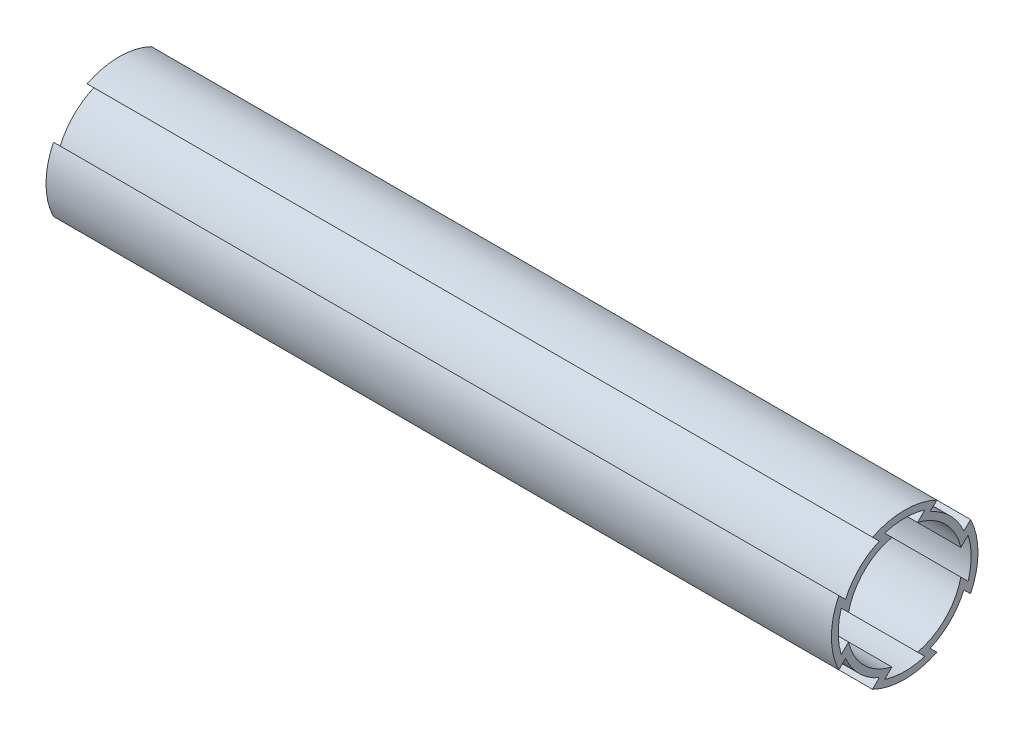
ISO-10303-21;
HEADER;
FILE_DESCRIPTION(('STEP AP214'),'2;1');
FILE_NAME('part.step','',(''),(''),'','','');
FILE_SCHEMA(('AUTOMOTIVE_DESIGN { 1 0 10303 214 1 1 1 1 }'));
ENDSEC;
DATA;
#1=APPLICATION_CONTEXT('core data for automotive mechanical design processes');
#2=APPLICATION_PROTOCOL_DEFINITION('international standard','automotive_design',2000,#1);
#3=PRODUCT_CONTEXT('',#1,'mechanical');
#4=PRODUCT('Part','Part','',(#3));
#5=PRODUCT_RELATED_PRODUCT_CATEGORY('part','',(#4));
#6=PRODUCT_DEFINITION_FORMATION('','',#4);
#7=PRODUCT_DEFINITION_CONTEXT('part definition',#1,'design');
#8=PRODUCT_DEFINITION('design','',#6,#7);
#9=PRODUCT_DEFINITION_SHAPE('','',#8);
#10=(LENGTH_UNIT() NAMED_UNIT(*) SI_UNIT(.MILLI.,.METRE.));
#11=(NAMED_UNIT(*) PLANE_ANGLE_UNIT() SI_UNIT($,.RADIAN.));
#12=(NAMED_UNIT(*) SI_UNIT($,.STERADIAN.) SOLID_ANGLE_UNIT());
#13=UNCERTAINTY_MEASURE_WITH_UNIT(LENGTH_MEASURE(1.E-05),#10,'distance_accuracy_value','');
#14=(GEOMETRIC_REPRESENTATION_CONTEXT(3) GLOBAL_UNCERTAINTY_ASSIGNED_CONTEXT((#13)) GLOBAL_UNIT_ASSIGNED_CONTEXT((#10,
#11,#12)) REPRESENTATION_CONTEXT('',''));
#15=CARTESIAN_POINT('',(0.,0.,0.));
#16=DIRECTION('',(0.,0.,1.));
#17=DIRECTION('',(1.,0.,0.));
#18=AXIS2_PLACEMENT_3D('',#15,#16,#17);
#19=CARTESIAN_POINT('',(150.,0.,0.));
#20=DIRECTION('',(1.,0.,0.));
#21=DIRECTION('',(0.,0.,-1.));
#22=AXIS2_PLACEMENT_3D('',#19,#20,#21);
#23=PLANE('',#22);
#24=CARTESIAN_POINT('',(150.,0.,0.));
#25=DIRECTION('',(1.,0.,0.));
#26=DIRECTION('',(0.,0.,-1.));
#27=AXIS2_PLACEMENT_3D('',#24,#25,#26);
#28=CIRCLE('',#27,12.3);
#29=CARTESIAN_POINT('',(150.,11.297790668331,4.86311895953339));
#30=VERTEX_POINT('',#29);
#31=CARTESIAN_POINT('',(150.,4.86311895953343,11.297790668331));
#32=VERTEX_POINT('',#31);
#33=EDGE_CURVE('E425',#30,#32,#28,.T.);
#34=ORIENTED_EDGE('',*,*,#33,.T.);
#35=DIRECTION('',(0.,0.707106781186547,0.707106781186547));
#36=VECTOR('',#35,1.);
#37=CARTESIAN_POINT('',(150.,4.86311895953343,11.297790668331));
#38=LINE('',#37,#36);
#39=CARTESIAN_POINT('',(150.,6.14475525816791,12.5794269669654));
#40=VERTEX_POINT('',#39);
#41=EDGE_CURVE('E429',#32,#40,#38,.T.);
#42=ORIENTED_EDGE('',*,*,#41,.T.);
#43=CARTESIAN_POINT('',(150.,0.,0.));
#44=DIRECTION('',(1.,0.,0.));
#45=DIRECTION('',(0.,0.,-1.));
#46=AXIS2_PLACEMENT_3D('',#43,#44,#45);
#47=CIRCLE('',#46,14.);
#48=CARTESIAN_POINT('',(150.,-6.14475525816791,12.5794269669654));
#49=VERTEX_POINT('',#48);
#50=EDGE_CURVE('E433',#40,#49,#47,.T.);
#51=ORIENTED_EDGE('',*,*,#50,.T.);
#52=DIRECTION('',(0.,0.707106781186548,-0.707106781186548));
#53=VECTOR('',#52,1.);
#54=CARTESIAN_POINT('',(150.,-6.14475525816792,12.5794269669654));
#55=LINE('',#54,#53);
#56=CARTESIAN_POINT('',(150.,-4.86311895953345,11.297790668331));
#57=VERTEX_POINT('',#56);
#58=EDGE_CURVE('E436',#49,#57,#55,.T.);
#59=ORIENTED_EDGE('',*,*,#58,.T.);
#60=CARTESIAN_POINT('',(150.,0.,0.));
#61=DIRECTION('',(1.,0.,0.));
#62=DIRECTION('',(0.,0.,-1.));
#63=AXIS2_PLACEMENT_3D('',#60,#61,#62);
#64=CIRCLE('',#63,12.3);
#65=CARTESIAN_POINT('',(150.,-11.297790668331,4.8631189595334));
#66=VERTEX_POINT('',#65);
#67=EDGE_CURVE('E439',#57,#66,#64,.T.);
#68=ORIENTED_EDGE('',*,*,#67,.T.);
#69=DIRECTION('',(0.,-0.707106781186547,0.707106781186547));
#70=VECTOR('',#69,1.);
#71=CARTESIAN_POINT('',(150.,-11.297790668331,4.86311895953339));
#72=LINE('',#71,#70);
#73=CARTESIAN_POINT('',(150.,-12.5794269669655,6.14475525816789));
#74=VERTEX_POINT('',#73);
#75=EDGE_CURVE('E442',#66,#74,#72,.T.);
#76=ORIENTED_EDGE('',*,*,#75,.T.);
#77=CARTESIAN_POINT('',(150.,0.,0.));
#78=DIRECTION('',(1.,0.,0.));
#79=DIRECTION('',(0.,0.,-1.));
#80=AXIS2_PLACEMENT_3D('',#77,#78,#79);
#81=CIRCLE('',#80,14.);
#82=CARTESIAN_POINT('',(150.,-12.5794269669655,-6.14475525816788));
#83=VERTEX_POINT('',#82);
#84=EDGE_CURVE('E445',#74,#83,#81,.T.);
#85=ORIENTED_EDGE('',*,*,#84,.T.);
#86=DIRECTION('',(0.,0.707106781186548,0.707106781186548));
#87=VECTOR('',#86,1.);
#88=CARTESIAN_POINT('',(150.,-12.5794269669655,-6.14475525816788));
#89=LINE('',#88,#87);
#90=CARTESIAN_POINT('',(150.,-11.297790668331,-4.86311895953338));
#91=VERTEX_POINT('',#90);
#92=EDGE_CURVE('E448',#83,#91,#89,.T.);
#93=ORIENTED_EDGE('',*,*,#92,.T.);
#94=CARTESIAN_POINT('',(150.,0.,0.));
#95=DIRECTION('',(1.,0.,0.));
#96=DIRECTION('',(0.,0.,-1.));
#97=AXIS2_PLACEMENT_3D('',#94,#95,#96);
#98=CIRCLE('',#97,12.3);
#99=CARTESIAN_POINT('',(150.,-4.86311895953344,-11.297790668331));
#100=VERTEX_POINT('',#99);
#101=EDGE_CURVE('E451',#91,#100,#98,.T.);
#102=ORIENTED_EDGE('',*,*,#101,.T.);
#103=DIRECTION('',(0.,-0.707106781186548,-0.707106781186548));
#104=VECTOR('',#103,1.);
#105=CARTESIAN_POINT('',(150.,-4.86311895953344,-11.297790668331));
#106=LINE('',#105,#104);
#107=CARTESIAN_POINT('',(150.,-6.14475525816793,-12.5794269669654));
#108=VERTEX_POINT('',#107);
#109=EDGE_CURVE('E454',#100,#108,#106,.T.);
#110=ORIENTED_EDGE('',*,*,#109,.T.);
#111=CARTESIAN_POINT('',(150.,0.,0.));
#112=DIRECTION('',(1.,0.,0.));
#113=DIRECTION('',(0.,0.,-1.));
#114=AXIS2_PLACEMENT_3D('',#111,#112,#113);
#115=CIRCLE('',#114,14.);
#116=CARTESIAN_POINT('',(150.,6.14475525816793,-12.5794269669654));
#117=VERTEX_POINT('',#116);
#118=EDGE_CURVE('E457',#108,#117,#115,.T.);
#119=ORIENTED_EDGE('',*,*,#118,.T.);
#120=DIRECTION('',(0.,-0.707106781186548,0.707106781186548));
#121=VECTOR('',#120,1.);
#122=CARTESIAN_POINT('',(150.,6.14475525816792,-12.5794269669654));
#123=LINE('',#122,#121);
#124=CARTESIAN_POINT('',(150.,4.86311895953344,-11.297790668331));
#125=VERTEX_POINT('',#124);
#126=EDGE_CURVE('E460',#117,#125,#123,.T.);
#127=ORIENTED_EDGE('',*,*,#126,.T.);
#128=CARTESIAN_POINT('',(150.,0.,0.));
#129=DIRECTION('',(1.,0.,0.));
#130=DIRECTION('',(0.,0.,-1.));
#131=AXIS2_PLACEMENT_3D('',#128,#129,#130);
#132=CIRCLE('',#131,12.3);
#133=CARTESIAN_POINT('',(150.,11.297790668331,-4.86311895953339));
#134=VERTEX_POINT('',#133);
#135=EDGE_CURVE('E463',#125,#134,#132,.T.);
#136=ORIENTED_EDGE('',*,*,#135,.T.);
#137=DIRECTION('',(0.,0.707106781186548,-0.707106781186548));
#138=VECTOR('',#137,1.);
#139=CARTESIAN_POINT('',(150.,11.297790668331,-4.86311895953339));
#140=LINE('',#139,#138);
#141=CARTESIAN_POINT('',(150.,12.5794269669655,-6.14475525816788));
#142=VERTEX_POINT('',#141);
#143=EDGE_CURVE('E466',#134,#142,#140,.T.);
#144=ORIENTED_EDGE('',*,*,#143,.T.);
#145=CARTESIAN_POINT('',(150.,0.,0.));
#146=DIRECTION('',(1.,0.,0.));
#147=DIRECTION('',(0.,0.,-1.));
#148=AXIS2_PLACEMENT_3D('',#145,#146,#147);
#149=CIRCLE('',#148,14.);
#150=CARTESIAN_POINT('',(150.,12.5794269669655,6.14475525816788));
#151=VERTEX_POINT('',#150);
#152=EDGE_CURVE('E469',#142,#151,#149,.T.);
#153=ORIENTED_EDGE('',*,*,#152,.T.);
#154=DIRECTION('',(0.,-0.707106781186547,-0.707106781186547));
#155=VECTOR('',#154,1.);
#156=CARTESIAN_POINT('',(150.,12.5794269669655,6.14475525816788));
#157=LINE('',#156,#155);
#158=EDGE_CURVE('E472',#151,#30,#157,.T.);
#159=ORIENTED_EDGE('',*,*,#158,.T.);
#160=EDGE_LOOP('',(#34,#42,#51,#59,#68,#76,#85,#93,#102,#110,#119,#127,#136,#144,#153,#159));
#161=FACE_BOUND('',#160,.T.);
#162=DIRECTION('',(0.,0.707106781186547,0.707106781186547));
#163=VECTOR('',#162,1.);
#164=CARTESIAN_POINT('',(150.,2.45043906922765,10.7235884091102));
#165=LINE('',#164,#163);
#166=CARTESIAN_POINT('',(150.,2.45043906922765,10.7235884091102));
#167=VERTEX_POINT('',#166);
#168=CARTESIAN_POINT('',(150.,3.834231437348,12.1073807772306));
#169=VERTEX_POINT('',#168);
#170=EDGE_CURVE('E264',#167,#169,#165,.T.);
#171=ORIENTED_EDGE('',*,*,#170,.F.);
#172=CARTESIAN_POINT('',(150.,0.,0.));
#173=DIRECTION('',(1.,0.,0.));
#174=DIRECTION('',(0.,0.,-1.));
#175=AXIS2_PLACEMENT_3D('',#172,#173,#174);
#176=CIRCLE('',#175,11.);
#177=CARTESIAN_POINT('',(150.,10.7235884091102,2.45043906922759));
#178=VERTEX_POINT('',#177);
#179=EDGE_CURVE('E255',#178,#167,#176,.T.);
#180=ORIENTED_EDGE('',*,*,#179,.F.);
#181=DIRECTION('',(0.,-0.707106781186548,-0.707106781186547));
#182=VECTOR('',#181,1.);
#183=CARTESIAN_POINT('',(150.,12.1073807772306,3.83423143734796));
#184=LINE('',#183,#182);
#185=CARTESIAN_POINT('',(150.,12.1073807772306,3.83423143734796));
#186=VERTEX_POINT('',#185);
#187=EDGE_CURVE('E320',#186,#178,#184,.T.);
#188=ORIENTED_EDGE('',*,*,#187,.F.);
#189=CARTESIAN_POINT('',(150.,0.,0.));
#190=DIRECTION('',(1.,0.,0.));
#191=DIRECTION('',(0.,0.,-1.));
#192=AXIS2_PLACEMENT_3D('',#189,#190,#191);
#193=CIRCLE('',#192,12.7);
#194=CARTESIAN_POINT('',(150.,12.1073807772306,-3.83423143734796));
#195=VERTEX_POINT('',#194);
#196=EDGE_CURVE('E317',#195,#186,#193,.T.);
#197=ORIENTED_EDGE('',*,*,#196,.F.);
#198=DIRECTION('',(0.,0.707106781186547,-0.707106781186548));
#199=VECTOR('',#198,1.);
#200=CARTESIAN_POINT('',(150.,10.7235884091102,-2.45043906922759));
#201=LINE('',#200,#199);
#202=CARTESIAN_POINT('',(150.,10.7235884091102,-2.45043906922759));
#203=VERTEX_POINT('',#202);
#204=EDGE_CURVE('E314',#203,#195,#201,.T.);
#205=ORIENTED_EDGE('',*,*,#204,.F.);
#206=CARTESIAN_POINT('',(150.,0.,0.));
#207=DIRECTION('',(1.,0.,0.));
#208=DIRECTION('',(0.,0.,-1.));
#209=AXIS2_PLACEMENT_3D('',#206,#207,#208);
#210=CIRCLE('',#209,11.);
#211=CARTESIAN_POINT('',(150.,2.45043906922765,-10.7235884091102));
#212=VERTEX_POINT('',#211);
#213=EDGE_CURVE('E311',#212,#203,#210,.T.);
#214=ORIENTED_EDGE('',*,*,#213,.F.);
#215=DIRECTION('',(0.,-0.707106781186547,0.707106781186548));
#216=VECTOR('',#215,1.);
#217=CARTESIAN_POINT('',(150.,3.83423143734802,-12.1073807772306));
#218=LINE('',#217,#216);
#219=CARTESIAN_POINT('',(150.,3.83423143734802,-12.1073807772306));
#220=VERTEX_POINT('',#219);
#221=EDGE_CURVE('E308',#220,#212,#218,.T.);
#222=ORIENTED_EDGE('',*,*,#221,.F.);
#223=CARTESIAN_POINT('',(150.,0.,0.));
#224=DIRECTION('',(1.,0.,0.));
#225=DIRECTION('',(0.,0.,-1.));
#226=AXIS2_PLACEMENT_3D('',#223,#224,#225);
#227=CIRCLE('',#226,12.7);
#228=CARTESIAN_POINT('',(150.,-3.83423143734802,-12.1073807772306));
#229=VERTEX_POINT('',#228);
#230=EDGE_CURVE('E305',#229,#220,#227,.T.);
#231=ORIENTED_EDGE('',*,*,#230,.F.);
#232=DIRECTION('',(0.,-0.707106781186547,-0.707106781186547));
#233=VECTOR('',#232,1.);
#234=CARTESIAN_POINT('',(150.,-2.45043906922765,-10.7235884091102));
#235=LINE('',#234,#233);
#236=CARTESIAN_POINT('',(150.,-2.45043906922766,-10.7235884091102));
#237=VERTEX_POINT('',#236);
#238=EDGE_CURVE('E302',#237,#229,#235,.T.);
#239=ORIENTED_EDGE('',*,*,#238,.F.);
#240=CARTESIAN_POINT('',(150.,0.,0.));
#241=DIRECTION('',(1.,0.,0.));
#242=DIRECTION('',(0.,0.,-1.));
#243=AXIS2_PLACEMENT_3D('',#240,#241,#242);
#244=CIRCLE('',#243,11.);
#245=CARTESIAN_POINT('',(150.,-10.7235884091102,-2.45043906922758));
#246=VERTEX_POINT('',#245);
#247=EDGE_CURVE('E299',#246,#237,#244,.T.);
#248=ORIENTED_EDGE('',*,*,#247,.F.);
#249=DIRECTION('',(0.,0.707106781186547,0.707106781186548));
#250=VECTOR('',#249,1.);
#251=CARTESIAN_POINT('',(150.,-12.1073807772306,-3.83423143734796));
#252=LINE('',#251,#250);
#253=CARTESIAN_POINT('',(150.,-12.1073807772306,-3.83423143734796));
#254=VERTEX_POINT('',#253);
#255=EDGE_CURVE('E296',#254,#246,#252,.T.);
#256=ORIENTED_EDGE('',*,*,#255,.F.);
#257=CARTESIAN_POINT('',(150.,0.,0.));
#258=DIRECTION('',(1.,0.,0.));
#259=DIRECTION('',(0.,0.,-1.));
#260=AXIS2_PLACEMENT_3D('',#257,#258,#259);
#261=CIRCLE('',#260,12.7);
#262=CARTESIAN_POINT('',(150.,-12.1073807772306,3.83423143734798));
#263=VERTEX_POINT('',#262);
#264=EDGE_CURVE('E293',#263,#254,#261,.T.);
#265=ORIENTED_EDGE('',*,*,#264,.F.);
#266=DIRECTION('',(0.,-0.707106781186548,0.707106781186548));
#267=VECTOR('',#266,1.);
#268=CARTESIAN_POINT('',(150.,-10.7235884091102,2.4504390692276));
#269=LINE('',#268,#267);
#270=CARTESIAN_POINT('',(150.,-10.7235884091102,2.4504390692276));
#271=VERTEX_POINT('',#270);
#272=EDGE_CURVE('E290',#271,#263,#269,.T.);
#273=ORIENTED_EDGE('',*,*,#272,.F.);
#274=CARTESIAN_POINT('',(150.,0.,0.));
#275=DIRECTION('',(1.,0.,0.));
#276=DIRECTION('',(0.,0.,-1.));
#277=AXIS2_PLACEMENT_3D('',#274,#275,#276);
#278=CIRCLE('',#277,11.);
#279=CARTESIAN_POINT('',(150.,-2.45043906922766,10.7235884091102));
#280=VERTEX_POINT('',#279);
#281=EDGE_CURVE('E287',#280,#271,#278,.T.);
#282=ORIENTED_EDGE('',*,*,#281,.F.);
#283=DIRECTION('',(0.,0.707106781186547,-0.707106781186548));
#284=VECTOR('',#283,1.);
#285=CARTESIAN_POINT('',(150.,-3.83423143734801,12.1073807772306));
#286=LINE('',#285,#284);
#287=CARTESIAN_POINT('',(150.,-3.83423143734801,12.1073807772306));
#288=VERTEX_POINT('',#287);
#289=EDGE_CURVE('E282',#288,#280,#286,.T.);
#290=ORIENTED_EDGE('',*,*,#289,.F.);
#291=CARTESIAN_POINT('',(150.,0.,0.));
#292=DIRECTION('',(1.,0.,0.));
#293=DIRECTION('',(0.,0.,-1.));
#294=AXIS2_PLACEMENT_3D('',#291,#292,#293);
#295=CIRCLE('',#294,12.7);
#296=EDGE_CURVE('E278',#169,#288,#295,.T.);
#297=ORIENTED_EDGE('',*,*,#296,.F.);
#298=EDGE_LOOP('',(#171,#180,#188,#197,#205,#214,#222,#231,#239,#248,#256,#265,#273,#282,#290,#297));
#299=FACE_BOUND('',#298,.T.);
#300=ADVANCED_FACE('F45',(#161,#299),#23,.T.);
#301=CARTESIAN_POINT('',(0.,0.,0.));
#302=DIRECTION('',(1.,0.,0.));
#303=DIRECTION('',(0.,0.,-1.));
#304=AXIS2_PLACEMENT_3D('',#301,#302,#303);
#305=PLANE('',#304);
#306=CARTESIAN_POINT('',(0.,0.,0.));
#307=DIRECTION('',(1.,0.,0.));
#308=DIRECTION('',(0.,0.,-1.));
#309=AXIS2_PLACEMENT_3D('',#306,#307,#308);
#310=CIRCLE('',#309,12.3);
#311=CARTESIAN_POINT('',(0.,11.297790668331,4.86311895953339));
#312=VERTEX_POINT('',#311);
#313=CARTESIAN_POINT('',(0.,4.86311895953343,11.297790668331));
#314=VERTEX_POINT('',#313);
#315=EDGE_CURVE('E273',#312,#314,#310,.T.);
#316=ORIENTED_EDGE('',*,*,#315,.F.);
#317=DIRECTION('',(0.,-0.707106781186547,-0.707106781186547));
#318=VECTOR('',#317,1.);
#319=CARTESIAN_POINT('',(0.,12.5794269669655,6.14475525816788));
#320=LINE('',#319,#318);
#321=CARTESIAN_POINT('',(0.,12.5794269669655,6.14475525816788));
#322=VERTEX_POINT('',#321);
#323=EDGE_CURVE('E430',#322,#312,#320,.T.);
#324=ORIENTED_EDGE('',*,*,#323,.F.);
#325=CARTESIAN_POINT('',(0.,0.,0.));
#326=DIRECTION('',(1.,0.,0.));
#327=DIRECTION('',(0.,0.,-1.));
#328=AXIS2_PLACEMENT_3D('',#325,#326,#327);
#329=CIRCLE('',#328,14.);
#330=CARTESIAN_POINT('',(0.,12.5794269669655,-6.14475525816788));
#331=VERTEX_POINT('',#330);
#332=EDGE_CURVE('E519',#331,#322,#329,.T.);
#333=ORIENTED_EDGE('',*,*,#332,.F.);
#334=DIRECTION('',(0.,0.707106781186548,-0.707106781186548));
#335=VECTOR('',#334,1.);
#336=CARTESIAN_POINT('',(0.,11.297790668331,-4.86311895953339));
#337=LINE('',#336,#335);
#338=CARTESIAN_POINT('',(0.,11.297790668331,-4.86311895953339));
#339=VERTEX_POINT('',#338);
#340=EDGE_CURVE('E516',#339,#331,#337,.T.);
#341=ORIENTED_EDGE('',*,*,#340,.F.);
#342=CARTESIAN_POINT('',(0.,0.,0.));
#343=DIRECTION('',(1.,0.,0.));
#344=DIRECTION('',(0.,0.,-1.));
#345=AXIS2_PLACEMENT_3D('',#342,#343,#344);
#346=CIRCLE('',#345,12.3);
#347=CARTESIAN_POINT('',(0.,4.86311895953344,-11.297790668331));
#348=VERTEX_POINT('',#347);
#349=EDGE_CURVE('E513',#348,#339,#346,.T.);
#350=ORIENTED_EDGE('',*,*,#349,.F.);
#351=DIRECTION('',(0.,-0.707106781186548,0.707106781186548));
#352=VECTOR('',#351,1.);
#353=CARTESIAN_POINT('',(0.,6.14475525816792,-12.5794269669654));
#354=LINE('',#353,#352);
#355=CARTESIAN_POINT('',(0.,6.14475525816793,-12.5794269669654));
#356=VERTEX_POINT('',#355);
#357=EDGE_CURVE('E510',#356,#348,#354,.T.);
#358=ORIENTED_EDGE('',*,*,#357,.F.);
#359=CARTESIAN_POINT('',(0.,0.,0.));
#360=DIRECTION('',(1.,0.,0.));
#361=DIRECTION('',(0.,0.,-1.));
#362=AXIS2_PLACEMENT_3D('',#359,#360,#361);
#363=CIRCLE('',#362,14.);
#364=CARTESIAN_POINT('',(0.,-6.14475525816793,-12.5794269669654));
#365=VERTEX_POINT('',#364);
#366=EDGE_CURVE('E507',#365,#356,#363,.T.);
#367=ORIENTED_EDGE('',*,*,#366,.F.);
#368=DIRECTION('',(0.,-0.707106781186548,-0.707106781186548));
#369=VECTOR('',#368,1.);
#370=CARTESIAN_POINT('',(0.,-4.86311895953344,-11.297790668331));
#371=LINE('',#370,#369);
#372=CARTESIAN_POINT('',(0.,-4.86311895953344,-11.297790668331));
#373=VERTEX_POINT('',#372);
#374=EDGE_CURVE('E503',#373,#365,#371,.T.);
#375=ORIENTED_EDGE('',*,*,#374,.F.);
#376=CARTESIAN_POINT('',(0.,0.,0.));
#377=DIRECTION('',(1.,0.,0.));
#378=DIRECTION('',(0.,0.,-1.));
#379=AXIS2_PLACEMENT_3D('',#376,#377,#378);
#380=CIRCLE('',#379,12.3);
#381=CARTESIAN_POINT('',(0.,-11.297790668331,-4.86311895953338));
#382=VERTEX_POINT('',#381);
#383=EDGE_CURVE('E500',#382,#373,#380,.T.);
#384=ORIENTED_EDGE('',*,*,#383,.F.);
#385=DIRECTION('',(0.,0.707106781186548,0.707106781186548));
#386=VECTOR('',#385,1.);
#387=CARTESIAN_POINT('',(0.,-12.5794269669655,-6.14475525816788));
#388=LINE('',#387,#386);
#389=CARTESIAN_POINT('',(0.,-12.5794269669655,-6.14475525816788));
#390=VERTEX_POINT('',#389);
#391=EDGE_CURVE('E497',#390,#382,#388,.T.);
#392=ORIENTED_EDGE('',*,*,#391,.F.);
#393=CARTESIAN_POINT('',(0.,0.,0.));
#394=DIRECTION('',(1.,0.,0.));
#395=DIRECTION('',(0.,0.,-1.));
#396=AXIS2_PLACEMENT_3D('',#393,#394,#395);
#397=CIRCLE('',#396,14.);
#398=CARTESIAN_POINT('',(0.,-12.5794269669655,6.14475525816789));
#399=VERTEX_POINT('',#398);
#400=EDGE_CURVE('E494',#399,#390,#397,.T.);
#401=ORIENTED_EDGE('',*,*,#400,.F.);
#402=DIRECTION('',(0.,-0.707106781186547,0.707106781186547));
#403=VECTOR('',#402,1.);
#404=CARTESIAN_POINT('',(0.,-11.297790668331,4.86311895953339));
#405=LINE('',#404,#403);
#406=CARTESIAN_POINT('',(0.,-11.297790668331,4.8631189595334));
#407=VERTEX_POINT('',#406);
#408=EDGE_CURVE('E491',#407,#399,#405,.T.);
#409=ORIENTED_EDGE('',*,*,#408,.F.);
#410=CARTESIAN_POINT('',(0.,0.,0.));
#411=DIRECTION('',(1.,0.,0.));
#412=DIRECTION('',(0.,0.,-1.));
#413=AXIS2_PLACEMENT_3D('',#410,#411,#412);
#414=CIRCLE('',#413,12.3);
#415=CARTESIAN_POINT('',(0.,-4.86311895953345,11.297790668331));
#416=VERTEX_POINT('',#415);
#417=EDGE_CURVE('E488',#416,#407,#414,.T.);
#418=ORIENTED_EDGE('',*,*,#417,.F.);
#419=DIRECTION('',(0.,0.707106781186548,-0.707106781186548));
#420=VECTOR('',#419,1.);
#421=CARTESIAN_POINT('',(0.,-6.14475525816792,12.5794269669654));
#422=LINE('',#421,#420);
#423=CARTESIAN_POINT('',(0.,-6.14475525816791,12.5794269669654));
#424=VERTEX_POINT('',#423);
#425=EDGE_CURVE('E485',#424,#416,#422,.T.);
#426=ORIENTED_EDGE('',*,*,#425,.F.);
#427=CARTESIAN_POINT('',(0.,0.,0.));
#428=DIRECTION('',(1.,0.,0.));
#429=DIRECTION('',(0.,0.,-1.));
#430=AXIS2_PLACEMENT_3D('',#427,#428,#429);
#431=CIRCLE('',#430,14.);
#432=CARTESIAN_POINT('',(0.,6.14475525816791,12.5794269669654));
#433=VERTEX_POINT('',#432);
#434=EDGE_CURVE('E482',#433,#424,#431,.T.);
#435=ORIENTED_EDGE('',*,*,#434,.F.);
#436=DIRECTION('',(0.,0.707106781186547,0.707106781186547));
#437=VECTOR('',#436,1.);
#438=CARTESIAN_POINT('',(0.,4.86311895953343,11.297790668331));
#439=LINE('',#438,#437);
#440=EDGE_CURVE('E479',#314,#433,#439,.T.);
#441=ORIENTED_EDGE('',*,*,#440,.F.);
#442=EDGE_LOOP('',(#316,#324,#333,#341,#350,#358,#367,#375,#384,#392,#401,#409,#418,#426,#435,#441));
#443=FACE_BOUND('',#442,.T.);
#444=CARTESIAN_POINT('',(0.,0.,0.));
#445=DIRECTION('',(1.,0.,0.));
#446=DIRECTION('',(0.,0.,-1.));
#447=AXIS2_PLACEMENT_3D('',#444,#445,#446);
#448=CIRCLE('',#447,11.);
#449=CARTESIAN_POINT('',(0.,10.7235884091102,2.45043906922759));
#450=VERTEX_POINT('',#449);
#451=CARTESIAN_POINT('',(0.,2.45043906922765,10.7235884091102));
#452=VERTEX_POINT('',#451);
#453=EDGE_CURVE('E69',#450,#452,#448,.T.);
#454=ORIENTED_EDGE('',*,*,#453,.T.);
#455=DIRECTION('',(0.,0.707106781186547,0.707106781186547));
#456=VECTOR('',#455,1.);
#457=CARTESIAN_POINT('',(0.,2.45043906922765,10.7235884091102));
#458=LINE('',#457,#456);
#459=CARTESIAN_POINT('',(0.,3.834231437348,12.1073807772306));
#460=VERTEX_POINT('',#459);
#461=EDGE_CURVE('E271',#452,#460,#458,.T.);
#462=ORIENTED_EDGE('',*,*,#461,.T.);
#463=CARTESIAN_POINT('',(0.,0.,0.));
#464=DIRECTION('',(1.,0.,0.));
#465=DIRECTION('',(0.,0.,-1.));
#466=AXIS2_PLACEMENT_3D('',#463,#464,#465);
#467=CIRCLE('',#466,12.7);
#468=CARTESIAN_POINT('',(0.,-3.83423143734801,12.1073807772306));
#469=VERTEX_POINT('',#468);
#470=EDGE_CURVE('E327',#460,#469,#467,.T.);
#471=ORIENTED_EDGE('',*,*,#470,.T.);
#472=DIRECTION('',(0.,0.707106781186547,-0.707106781186548));
#473=VECTOR('',#472,1.);
#474=CARTESIAN_POINT('',(0.,-3.83423143734801,12.1073807772306));
#475=LINE('',#474,#473);
#476=CARTESIAN_POINT('',(0.,-2.45043906922766,10.7235884091102));
#477=VERTEX_POINT('',#476);
#478=EDGE_CURVE('E331',#469,#477,#475,.T.);
#479=ORIENTED_EDGE('',*,*,#478,.T.);
#480=CARTESIAN_POINT('',(0.,0.,0.));
#481=DIRECTION('',(1.,0.,0.));
#482=DIRECTION('',(0.,0.,-1.));
#483=AXIS2_PLACEMENT_3D('',#480,#481,#482);
#484=CIRCLE('',#483,11.);
#485=CARTESIAN_POINT('',(0.,-10.7235884091102,2.4504390692276));
#486=VERTEX_POINT('',#485);
#487=EDGE_CURVE('E335',#477,#486,#484,.T.);
#488=ORIENTED_EDGE('',*,*,#487,.T.);
#489=DIRECTION('',(0.,-0.707106781186548,0.707106781186548));
#490=VECTOR('',#489,1.);
#491=CARTESIAN_POINT('',(0.,-10.7235884091102,2.4504390692276));
#492=LINE('',#491,#490);
#493=CARTESIAN_POINT('',(0.,-12.1073807772306,3.83423143734798));
#494=VERTEX_POINT('',#493);
#495=EDGE_CURVE('E339',#486,#494,#492,.T.);
#496=ORIENTED_EDGE('',*,*,#495,.T.);
#497=CARTESIAN_POINT('',(0.,0.,0.));
#498=DIRECTION('',(1.,0.,0.));
#499=DIRECTION('',(0.,0.,-1.));
#500=AXIS2_PLACEMENT_3D('',#497,#498,#499);
#501=CIRCLE('',#500,12.7);
#502=CARTESIAN_POINT('',(0.,-12.1073807772306,-3.83423143734796));
#503=VERTEX_POINT('',#502);
#504=EDGE_CURVE('E343',#494,#503,#501,.T.);
#505=ORIENTED_EDGE('',*,*,#504,.T.);
#506=DIRECTION('',(0.,0.707106781186547,0.707106781186548));
#507=VECTOR('',#506,1.);
#508=CARTESIAN_POINT('',(0.,-12.1073807772306,-3.83423143734796));
#509=LINE('',#508,#507);
#510=CARTESIAN_POINT('',(0.,-10.7235884091102,-2.45043906922758));
#511=VERTEX_POINT('',#510);
#512=EDGE_CURVE('E347',#503,#511,#509,.T.);
#513=ORIENTED_EDGE('',*,*,#512,.T.);
#514=CARTESIAN_POINT('',(0.,0.,0.));
#515=DIRECTION('',(1.,0.,0.));
#516=DIRECTION('',(0.,0.,-1.));
#517=AXIS2_PLACEMENT_3D('',#514,#515,#516);
#518=CIRCLE('',#517,11.);
#519=CARTESIAN_POINT('',(0.,-2.45043906922766,-10.7235884091102));
#520=VERTEX_POINT('',#519);
#521=EDGE_CURVE('E351',#511,#520,#518,.T.);
#522=ORIENTED_EDGE('',*,*,#521,.T.);
#523=DIRECTION('',(0.,-0.707106781186547,-0.707106781186547));
#524=VECTOR('',#523,1.);
#525=CARTESIAN_POINT('',(0.,-2.45043906922765,-10.7235884091102));
#526=LINE('',#525,#524);
#527=CARTESIAN_POINT('',(0.,-3.83423143734802,-12.1073807772306));
#528=VERTEX_POINT('',#527);
#529=EDGE_CURVE('E355',#520,#528,#526,.T.);
#530=ORIENTED_EDGE('',*,*,#529,.T.);
#531=CARTESIAN_POINT('',(0.,0.,0.));
#532=DIRECTION('',(1.,0.,0.));
#533=DIRECTION('',(0.,0.,-1.));
#534=AXIS2_PLACEMENT_3D('',#531,#532,#533);
#535=CIRCLE('',#534,12.7);
#536=CARTESIAN_POINT('',(0.,3.83423143734802,-12.1073807772306));
#537=VERTEX_POINT('',#536);
#538=EDGE_CURVE('E359',#528,#537,#535,.T.);
#539=ORIENTED_EDGE('',*,*,#538,.T.);
#540=DIRECTION('',(0.,-0.707106781186547,0.707106781186548));
#541=VECTOR('',#540,1.);
#542=CARTESIAN_POINT('',(0.,3.83423143734802,-12.1073807772306));
#543=LINE('',#542,#541);
#544=CARTESIAN_POINT('',(0.,2.45043906922765,-10.7235884091102));
#545=VERTEX_POINT('',#544);
#546=EDGE_CURVE('E363',#537,#545,#543,.T.);
#547=ORIENTED_EDGE('',*,*,#546,.T.);
#548=CARTESIAN_POINT('',(0.,0.,0.));
#549=DIRECTION('',(1.,0.,0.));
#550=DIRECTION('',(0.,0.,-1.));
#551=AXIS2_PLACEMENT_3D('',#548,#549,#550);
#552=CIRCLE('',#551,11.);
#553=CARTESIAN_POINT('',(0.,10.7235884091102,-2.45043906922759));
#554=VERTEX_POINT('',#553);
#555=EDGE_CURVE('E367',#545,#554,#552,.T.);
#556=ORIENTED_EDGE('',*,*,#555,.T.);
#557=DIRECTION('',(0.,0.707106781186547,-0.707106781186548));
#558=VECTOR('',#557,1.);
#559=CARTESIAN_POINT('',(0.,10.7235884091102,-2.45043906922759));
#560=LINE('',#559,#558);
#561=CARTESIAN_POINT('',(0.,12.1073807772306,-3.83423143734796));
#562=VERTEX_POINT('',#561);
#563=EDGE_CURVE('E371',#554,#562,#560,.T.);
#564=ORIENTED_EDGE('',*,*,#563,.T.);
#565=CARTESIAN_POINT('',(0.,0.,0.));
#566=DIRECTION('',(1.,0.,0.));
#567=DIRECTION('',(0.,0.,-1.));
#568=AXIS2_PLACEMENT_3D('',#565,#566,#567);
#569=CIRCLE('',#568,12.7);
#570=CARTESIAN_POINT('',(0.,12.1073807772306,3.83423143734796));
#571=VERTEX_POINT('',#570);
#572=EDGE_CURVE('E375',#562,#571,#569,.T.);
#573=ORIENTED_EDGE('',*,*,#572,.T.);
#574=DIRECTION('',(0.,-0.707106781186548,-0.707106781186547));
#575=VECTOR('',#574,1.);
#576=CARTESIAN_POINT('',(0.,12.1073807772306,3.83423143734796));
#577=LINE('',#576,#575);
#578=EDGE_CURVE('E265',#571,#450,#577,.T.);
#579=ORIENTED_EDGE('',*,*,#578,.T.);
#580=EDGE_LOOP('',(#454,#462,#471,#479,#488,#496,#505,#513,#522,#530,#539,#547,#556,#564,#573,#579));
#581=FACE_BOUND('',#580,.T.);
#582=ADVANCED_FACE('F590',(#443,#581),#305,.F.);
#583=CARTESIAN_POINT('',(150.,0.,0.));
#584=DIRECTION('',(-1.,0.,0.));
#585=DIRECTION('',(0.,0.,1.));
#586=AXIS2_PLACEMENT_3D('',#583,#584,#585);
#587=CYLINDRICAL_SURFACE('',#586,12.3);
#588=ORIENTED_EDGE('',*,*,#315,.T.);
#589=DIRECTION('',(-1.,0.,0.));
#590=VECTOR('',#589,1.);
#591=CARTESIAN_POINT('',(150.,4.86311895953343,11.297790668331));
#592=LINE('',#591,#590);
#593=EDGE_CURVE('E11',#32,#314,#592,.T.);
#594=ORIENTED_EDGE('',*,*,#593,.F.);
#595=ORIENTED_EDGE('',*,*,#33,.F.);
#596=DIRECTION('',(-1.,0.,0.));
#597=VECTOR('',#596,1.);
#598=CARTESIAN_POINT('',(150.,11.297790668331,4.86311895953339));
#599=LINE('',#598,#597);
#600=EDGE_CURVE('E475',#30,#312,#599,.T.);
#601=ORIENTED_EDGE('',*,*,#600,.T.);
#602=EDGE_LOOP('',(#588,#594,#595,#601));
#603=FACE_BOUND('',#602,.T.);
#604=ADVANCED_FACE('F47',(#603),#587,.T.);
#605=CARTESIAN_POINT('',(150.,4.86311895953343,11.297790668331));
#606=DIRECTION('',(0.,-0.707106781186547,0.707106781186547));
#607=DIRECTION('',(0.,-0.707106781186548,-0.707106781186548));
#608=AXIS2_PLACEMENT_3D('',#605,#606,#607);
#609=PLANE('',#608);
#610=ORIENTED_EDGE('',*,*,#440,.T.);
#611=DIRECTION('',(-1.,0.,0.));
#612=VECTOR('',#611,1.);
#613=CARTESIAN_POINT('',(150.,6.14475525816791,12.5794269669654));
#614=LINE('',#613,#612);
#615=EDGE_CURVE('E54',#40,#433,#614,.T.);
#616=ORIENTED_EDGE('',*,*,#615,.F.);
#617=ORIENTED_EDGE('',*,*,#41,.F.);
#618=ORIENTED_EDGE('',*,*,#593,.T.);
#619=EDGE_LOOP('',(#610,#616,#617,#618));
#620=FACE_BOUND('',#619,.T.);
#621=ADVANCED_FACE('F607',(#620),#609,.F.);
#622=CARTESIAN_POINT('',(150.,0.,0.));
#623=DIRECTION('',(-1.,0.,0.));
#624=DIRECTION('',(0.,0.,1.));
#625=AXIS2_PLACEMENT_3D('',#622,#623,#624);
#626=CYLINDRICAL_SURFACE('',#625,14.);
#627=ORIENTED_EDGE('',*,*,#434,.T.);
#628=DIRECTION('',(-1.,0.,0.));
#629=VECTOR('',#628,1.);
#630=CARTESIAN_POINT('',(150.,-6.14475525816791,12.5794269669654));
#631=LINE('',#630,#629);
#632=EDGE_CURVE('E575',#49,#424,#631,.T.);
#633=ORIENTED_EDGE('',*,*,#632,.F.);
#634=ORIENTED_EDGE('',*,*,#50,.F.);
#635=ORIENTED_EDGE('',*,*,#615,.T.);
#636=EDGE_LOOP('',(#627,#633,#634,#635));
#637=FACE_BOUND('',#636,.T.);
#638=ADVANCED_FACE('F584',(#637),#626,.T.);
#639=CARTESIAN_POINT('',(150.,-6.14475525816792,12.5794269669654));
#640=DIRECTION('',(0.,0.707106781186548,0.707106781186548));
#641=DIRECTION('',(0.,-0.707106781186548,0.707106781186548));
#642=AXIS2_PLACEMENT_3D('',#639,#640,#641);
#643=PLANE('',#642);
#644=ORIENTED_EDGE('',*,*,#425,.T.);
#645=DIRECTION('',(-1.,0.,0.));
#646=VECTOR('',#645,1.);
#647=CARTESIAN_POINT('',(150.,-4.86311895953345,11.297790668331));
#648=LINE('',#647,#646);
#649=EDGE_CURVE('E571',#57,#416,#648,.T.);
#650=ORIENTED_EDGE('',*,*,#649,.F.);
#651=ORIENTED_EDGE('',*,*,#58,.F.);
#652=ORIENTED_EDGE('',*,*,#632,.T.);
#653=EDGE_LOOP('',(#644,#650,#651,#652));
#654=FACE_BOUND('',#653,.T.);
#655=ADVANCED_FACE('F596',(#654),#643,.F.);
#656=CARTESIAN_POINT('',(150.,0.,0.));
#657=DIRECTION('',(-1.,0.,0.));
#658=DIRECTION('',(0.,0.,1.));
#659=AXIS2_PLACEMENT_3D('',#656,#657,#658);
#660=CYLINDRICAL_SURFACE('',#659,12.3);
#661=ORIENTED_EDGE('',*,*,#417,.T.);
#662=DIRECTION('',(-1.,0.,0.));
#663=VECTOR('',#662,1.);
#664=CARTESIAN_POINT('',(150.,-11.297790668331,4.8631189595334));
#665=LINE('',#664,#663);
#666=EDGE_CURVE('E567',#66,#407,#665,.T.);
#667=ORIENTED_EDGE('',*,*,#666,.F.);
#668=ORIENTED_EDGE('',*,*,#67,.F.);
#669=ORIENTED_EDGE('',*,*,#649,.T.);
#670=EDGE_LOOP('',(#661,#667,#668,#669));
#671=FACE_BOUND('',#670,.T.);
#672=ADVANCED_FACE('F600',(#671),#660,.T.);
#673=CARTESIAN_POINT('',(150.,-11.297790668331,4.86311895953339));
#674=DIRECTION('',(0.,-0.707106781186547,-0.707106781186547));
#675=DIRECTION('',(0.,0.707106781186548,-0.707106781186548));
#676=AXIS2_PLACEMENT_3D('',#673,#674,#675);
#677=PLANE('',#676);
#678=ORIENTED_EDGE('',*,*,#408,.T.);
#679=DIRECTION('',(-1.,0.,0.));
#680=VECTOR('',#679,1.);
#681=CARTESIAN_POINT('',(150.,-12.5794269669655,6.14475525816789));
#682=LINE('',#681,#680);
#683=EDGE_CURVE('E563',#74,#399,#682,.T.);
#684=ORIENTED_EDGE('',*,*,#683,.F.);
#685=ORIENTED_EDGE('',*,*,#75,.F.);
#686=ORIENTED_EDGE('',*,*,#666,.T.);
#687=EDGE_LOOP('',(#678,#684,#685,#686));
#688=FACE_BOUND('',#687,.T.);
#689=ADVANCED_FACE('F659',(#688),#677,.F.);
#690=CARTESIAN_POINT('',(150.,0.,0.));
#691=DIRECTION('',(-1.,0.,0.));
#692=DIRECTION('',(0.,0.,1.));
#693=AXIS2_PLACEMENT_3D('',#690,#691,#692);
#694=CYLINDRICAL_SURFACE('',#693,14.);
#695=ORIENTED_EDGE('',*,*,#400,.T.);
#696=DIRECTION('',(-1.,0.,0.));
#697=VECTOR('',#696,1.);
#698=CARTESIAN_POINT('',(150.,-12.5794269669655,-6.14475525816788));
#699=LINE('',#698,#697);
#700=EDGE_CURVE('E559',#83,#390,#699,.T.);
#701=ORIENTED_EDGE('',*,*,#700,.F.);
#702=ORIENTED_EDGE('',*,*,#84,.F.);
#703=ORIENTED_EDGE('',*,*,#683,.T.);
#704=EDGE_LOOP('',(#695,#701,#702,#703));
#705=FACE_BOUND('',#704,.T.);
#706=ADVANCED_FACE('F657',(#705),#694,.T.);
#707=CARTESIAN_POINT('',(150.,-12.5794269669655,-6.14475525816788));
#708=DIRECTION('',(0.,-0.707106781186548,0.707106781186548));
#709=DIRECTION('',(0.,-0.707106781186548,-0.707106781186548));
#710=AXIS2_PLACEMENT_3D('',#707,#708,#709);
#711=PLANE('',#710);
#712=ORIENTED_EDGE('',*,*,#391,.T.);
#713=DIRECTION('',(-1.,0.,0.));
#714=VECTOR('',#713,1.);
#715=CARTESIAN_POINT('',(150.,-11.297790668331,-4.86311895953338));
#716=LINE('',#715,#714);
#717=EDGE_CURVE('E555',#91,#382,#716,.T.);
#718=ORIENTED_EDGE('',*,*,#717,.F.);
#719=ORIENTED_EDGE('',*,*,#92,.F.);
#720=ORIENTED_EDGE('',*,*,#700,.T.);
#721=EDGE_LOOP('',(#712,#718,#719,#720));
#722=FACE_BOUND('',#721,.T.);
#723=ADVANCED_FACE('F652',(#722),#711,.F.);
#724=CARTESIAN_POINT('',(150.,0.,0.));
#725=DIRECTION('',(-1.,0.,0.));
#726=DIRECTION('',(0.,0.,1.));
#727=AXIS2_PLACEMENT_3D('',#724,#725,#726);
#728=CYLINDRICAL_SURFACE('',#727,12.3);
#729=ORIENTED_EDGE('',*,*,#383,.T.);
#730=DIRECTION('',(-1.,0.,0.));
#731=VECTOR('',#730,1.);
#732=CARTESIAN_POINT('',(150.,-4.86311895953344,-11.297790668331));
#733=LINE('',#732,#731);
#734=EDGE_CURVE('E551',#100,#373,#733,.T.);
#735=ORIENTED_EDGE('',*,*,#734,.F.);
#736=ORIENTED_EDGE('',*,*,#101,.F.);
#737=ORIENTED_EDGE('',*,*,#717,.T.);
#738=EDGE_LOOP('',(#729,#735,#736,#737));
#739=FACE_BOUND('',#738,.T.);
#740=ADVANCED_FACE('F647',(#739),#728,.T.);
#741=CARTESIAN_POINT('',(150.,-4.86311895953344,-11.297790668331));
#742=DIRECTION('',(0.,0.707106781186548,-0.707106781186548));
#743=DIRECTION('',(0.,0.707106781186548,0.707106781186548));
#744=AXIS2_PLACEMENT_3D('',#741,#742,#743);
#745=PLANE('',#744);
#746=ORIENTED_EDGE('',*,*,#374,.T.);
#747=DIRECTION('',(-1.,0.,0.));
#748=VECTOR('',#747,1.);
#749=CARTESIAN_POINT('',(150.,-6.14475525816793,-12.5794269669654));
#750=LINE('',#749,#748);
#751=EDGE_CURVE('E547',#108,#365,#750,.T.);
#752=ORIENTED_EDGE('',*,*,#751,.F.);
#753=ORIENTED_EDGE('',*,*,#109,.F.);
#754=ORIENTED_EDGE('',*,*,#734,.T.);
#755=EDGE_LOOP('',(#746,#752,#753,#754));
#756=FACE_BOUND('',#755,.T.);
#757=ADVANCED_FACE('F642',(#756),#745,.F.);
#758=CARTESIAN_POINT('',(150.,0.,0.));
#759=DIRECTION('',(-1.,0.,0.));
#760=DIRECTION('',(0.,0.,1.));
#761=AXIS2_PLACEMENT_3D('',#758,#759,#760);
#762=CYLINDRICAL_SURFACE('',#761,14.);
#763=ORIENTED_EDGE('',*,*,#366,.T.);
#764=DIRECTION('',(-1.,0.,0.));
#765=VECTOR('',#764,1.);
#766=CARTESIAN_POINT('',(150.,6.14475525816793,-12.5794269669654));
#767=LINE('',#766,#765);
#768=EDGE_CURVE('E543',#117,#356,#767,.T.);
#769=ORIENTED_EDGE('',*,*,#768,.F.);
#770=ORIENTED_EDGE('',*,*,#118,.F.);
#771=ORIENTED_EDGE('',*,*,#751,.T.);
#772=EDGE_LOOP('',(#763,#769,#770,#771));
#773=FACE_BOUND('',#772,.T.);
#774=ADVANCED_FACE('F637',(#773),#762,.T.);
#775=CARTESIAN_POINT('',(150.,6.14475525816792,-12.5794269669654));
#776=DIRECTION('',(0.,-0.707106781186548,-0.707106781186548));
#777=DIRECTION('',(0.,0.707106781186548,-0.707106781186548));
#778=AXIS2_PLACEMENT_3D('',#775,#776,#777);
#779=PLANE('',#778);
#780=ORIENTED_EDGE('',*,*,#357,.T.);
#781=DIRECTION('',(-1.,0.,0.));
#782=VECTOR('',#781,1.);
#783=CARTESIAN_POINT('',(150.,4.86311895953344,-11.297790668331));
#784=LINE('',#783,#782);
#785=EDGE_CURVE('E539',#125,#348,#784,.T.);
#786=ORIENTED_EDGE('',*,*,#785,.F.);
#787=ORIENTED_EDGE('',*,*,#126,.F.);
#788=ORIENTED_EDGE('',*,*,#768,.T.);
#789=EDGE_LOOP('',(#780,#786,#787,#788));
#790=FACE_BOUND('',#789,.T.);
#791=ADVANCED_FACE('F633',(#790),#779,.F.);
#792=CARTESIAN_POINT('',(150.,0.,0.));
#793=DIRECTION('',(-1.,0.,0.));
#794=DIRECTION('',(0.,0.,1.));
#795=AXIS2_PLACEMENT_3D('',#792,#793,#794);
#796=CYLINDRICAL_SURFACE('',#795,12.3);
#797=ORIENTED_EDGE('',*,*,#349,.T.);
#798=DIRECTION('',(-1.,0.,0.));
#799=VECTOR('',#798,1.);
#800=CARTESIAN_POINT('',(150.,11.297790668331,-4.86311895953339));
#801=LINE('',#800,#799);
#802=EDGE_CURVE('E535',#134,#339,#801,.T.);
#803=ORIENTED_EDGE('',*,*,#802,.F.);
#804=ORIENTED_EDGE('',*,*,#135,.F.);
#805=ORIENTED_EDGE('',*,*,#785,.T.);
#806=EDGE_LOOP('',(#797,#803,#804,#805));
#807=FACE_BOUND('',#806,.T.);
#808=ADVANCED_FACE('F628',(#807),#796,.T.);
#809=CARTESIAN_POINT('',(150.,11.297790668331,-4.86311895953339));
#810=DIRECTION('',(0.,0.707106781186548,0.707106781186548));
#811=DIRECTION('',(0.,-0.707106781186548,0.707106781186548));
#812=AXIS2_PLACEMENT_3D('',#809,#810,#811);
#813=PLANE('',#812);
#814=ORIENTED_EDGE('',*,*,#340,.T.);
#815=DIRECTION('',(-1.,0.,0.));
#816=VECTOR('',#815,1.);
#817=CARTESIAN_POINT('',(150.,12.5794269669655,-6.14475525816788));
#818=LINE('',#817,#816);
#819=EDGE_CURVE('E531',#142,#331,#818,.T.);
#820=ORIENTED_EDGE('',*,*,#819,.F.);
#821=ORIENTED_EDGE('',*,*,#143,.F.);
#822=ORIENTED_EDGE('',*,*,#802,.T.);
#823=EDGE_LOOP('',(#814,#820,#821,#822));
#824=FACE_BOUND('',#823,.T.);
#825=ADVANCED_FACE('F623',(#824),#813,.F.);
#826=CARTESIAN_POINT('',(150.,0.,0.));
#827=DIRECTION('',(-1.,0.,0.));
#828=DIRECTION('',(0.,0.,1.));
#829=AXIS2_PLACEMENT_3D('',#826,#827,#828);
#830=CYLINDRICAL_SURFACE('',#829,14.);
#831=ORIENTED_EDGE('',*,*,#332,.T.);
#832=DIRECTION('',(-1.,0.,0.));
#833=VECTOR('',#832,1.);
#834=CARTESIAN_POINT('',(150.,12.5794269669655,6.14475525816788));
#835=LINE('',#834,#833);
#836=EDGE_CURVE('E527',#151,#322,#835,.T.);
#837=ORIENTED_EDGE('',*,*,#836,.F.);
#838=ORIENTED_EDGE('',*,*,#152,.F.);
#839=ORIENTED_EDGE('',*,*,#819,.T.);
#840=EDGE_LOOP('',(#831,#837,#838,#839));
#841=FACE_BOUND('',#840,.T.);
#842=ADVANCED_FACE('F619',(#841),#830,.T.);
#843=CARTESIAN_POINT('',(150.,12.5794269669655,6.14475525816788));
#844=DIRECTION('',(0.,0.707106781186547,-0.707106781186547));
#845=DIRECTION('',(0.,0.707106781186548,0.707106781186548));
#846=AXIS2_PLACEMENT_3D('',#843,#844,#845);
#847=PLANE('',#846);
#848=ORIENTED_EDGE('',*,*,#323,.T.);
#849=ORIENTED_EDGE('',*,*,#600,.F.);
#850=ORIENTED_EDGE('',*,*,#158,.F.);
#851=ORIENTED_EDGE('',*,*,#836,.T.);
#852=EDGE_LOOP('',(#848,#849,#850,#851));
#853=FACE_BOUND('',#852,.T.);
#854=ADVANCED_FACE('F614',(#853),#847,.F.);
#855=CARTESIAN_POINT('',(150.,0.,0.));
#856=DIRECTION('',(-1.,0.,0.));
#857=DIRECTION('',(0.,0.,1.));
#858=AXIS2_PLACEMENT_3D('',#855,#856,#857);
#859=CYLINDRICAL_SURFACE('',#858,11.);
#860=ORIENTED_EDGE('',*,*,#453,.F.);
#861=DIRECTION('',(-1.,0.,0.));
#862=VECTOR('',#861,1.);
#863=CARTESIAN_POINT('',(150.,10.7235884091102,2.45043906922759));
#864=LINE('',#863,#862);
#865=EDGE_CURVE('E259',#178,#450,#864,.T.);
#866=ORIENTED_EDGE('',*,*,#865,.F.);
#867=ORIENTED_EDGE('',*,*,#179,.T.);
#868=DIRECTION('',(-1.,0.,0.));
#869=VECTOR('',#868,1.);
#870=CARTESIAN_POINT('',(150.,2.45043906922765,10.7235884091102));
#871=LINE('',#870,#869);
#872=EDGE_CURVE('E258',#167,#452,#871,.T.);
#873=ORIENTED_EDGE('',*,*,#872,.T.);
#874=EDGE_LOOP('',(#860,#866,#867,#873));
#875=FACE_BOUND('',#874,.T.);
#876=ADVANCED_FACE('F257',(#875),#859,.F.);
#877=CARTESIAN_POINT('',(150.,2.45043906922765,10.7235884091102));
#878=DIRECTION('',(0.,-0.707106781186547,0.707106781186547));
#879=DIRECTION('',(0.,-0.707106781186548,-0.707106781186548));
#880=AXIS2_PLACEMENT_3D('',#877,#878,#879);
#881=PLANE('',#880);
#882=ORIENTED_EDGE('',*,*,#461,.F.);
#883=ORIENTED_EDGE('',*,*,#872,.F.);
#884=ORIENTED_EDGE('',*,*,#170,.T.);
#885=DIRECTION('',(-1.,0.,0.));
#886=VECTOR('',#885,1.);
#887=CARTESIAN_POINT('',(150.,3.834231437348,12.1073807772306));
#888=LINE('',#887,#886);
#889=EDGE_CURVE('E274',#169,#460,#888,.T.);
#890=ORIENTED_EDGE('',*,*,#889,.T.);
#891=EDGE_LOOP('',(#882,#883,#884,#890));
#892=FACE_BOUND('',#891,.T.);
#893=ADVANCED_FACE('F268',(#892),#881,.T.);
#894=CARTESIAN_POINT('',(150.,0.,0.));
#895=DIRECTION('',(-1.,0.,0.));
#896=DIRECTION('',(0.,0.,1.));
#897=AXIS2_PLACEMENT_3D('',#894,#895,#896);
#898=CYLINDRICAL_SURFACE('',#897,12.7);
#899=ORIENTED_EDGE('',*,*,#470,.F.);
#900=ORIENTED_EDGE('',*,*,#889,.F.);
#901=ORIENTED_EDGE('',*,*,#296,.T.);
#902=DIRECTION('',(-1.,0.,0.));
#903=VECTOR('',#902,1.);
#904=CARTESIAN_POINT('',(150.,-3.83423143734801,12.1073807772306));
#905=LINE('',#904,#903);
#906=EDGE_CURVE('E420',#288,#469,#905,.T.);
#907=ORIENTED_EDGE('',*,*,#906,.T.);
#908=EDGE_LOOP('',(#899,#900,#901,#907));
#909=FACE_BOUND('',#908,.T.);
#910=ADVANCED_FACE('F751',(#909),#898,.F.);
#911=CARTESIAN_POINT('',(150.,-3.83423143734801,12.1073807772306));
#912=DIRECTION('',(0.,0.707106781186548,0.707106781186547));
#913=DIRECTION('',(0.,-0.707106781186547,0.707106781186548));
#914=AXIS2_PLACEMENT_3D('',#911,#912,#913);
#915=PLANE('',#914);
#916=ORIENTED_EDGE('',*,*,#478,.F.);
#917=ORIENTED_EDGE('',*,*,#906,.F.);
#918=ORIENTED_EDGE('',*,*,#289,.T.);
#919=DIRECTION('',(-1.,0.,0.));
#920=VECTOR('',#919,1.);
#921=CARTESIAN_POINT('',(150.,-2.45043906922766,10.7235884091102));
#922=LINE('',#921,#920);
#923=EDGE_CURVE('E417',#280,#477,#922,.T.);
#924=ORIENTED_EDGE('',*,*,#923,.T.);
#925=EDGE_LOOP('',(#916,#917,#918,#924));
#926=FACE_BOUND('',#925,.T.);
#927=ADVANCED_FACE('F758',(#926),#915,.T.);
#928=CARTESIAN_POINT('',(150.,0.,0.));
#929=DIRECTION('',(-1.,0.,0.));
#930=DIRECTION('',(0.,0.,1.));
#931=AXIS2_PLACEMENT_3D('',#928,#929,#930);
#932=CYLINDRICAL_SURFACE('',#931,11.);
#933=ORIENTED_EDGE('',*,*,#487,.F.);
#934=ORIENTED_EDGE('',*,*,#923,.F.);
#935=ORIENTED_EDGE('',*,*,#281,.T.);
#936=DIRECTION('',(-1.,0.,0.));
#937=VECTOR('',#936,1.);
#938=CARTESIAN_POINT('',(150.,-10.7235884091102,2.4504390692276));
#939=LINE('',#938,#937);
#940=EDGE_CURVE('E414',#271,#486,#939,.T.);
#941=ORIENTED_EDGE('',*,*,#940,.T.);
#942=EDGE_LOOP('',(#933,#934,#935,#941));
#943=FACE_BOUND('',#942,.T.);
#944=ADVANCED_FACE('F767',(#943),#932,.F.);
#945=CARTESIAN_POINT('',(150.,-10.7235884091102,2.4504390692276));
#946=DIRECTION('',(0.,-0.707106781186548,-0.707106781186548));
#947=DIRECTION('',(0.,0.707106781186548,-0.707106781186548));
#948=AXIS2_PLACEMENT_3D('',#945,#946,#947);
#949=PLANE('',#948);
#950=ORIENTED_EDGE('',*,*,#495,.F.);
#951=ORIENTED_EDGE('',*,*,#940,.F.);
#952=ORIENTED_EDGE('',*,*,#272,.T.);
#953=DIRECTION('',(-1.,0.,0.));
#954=VECTOR('',#953,1.);
#955=CARTESIAN_POINT('',(150.,-12.1073807772306,3.83423143734798));
#956=LINE('',#955,#954);
#957=EDGE_CURVE('E411',#263,#494,#956,.T.);
#958=ORIENTED_EDGE('',*,*,#957,.T.);
#959=EDGE_LOOP('',(#950,#951,#952,#958));
#960=FACE_BOUND('',#959,.T.);
#961=ADVANCED_FACE('F776',(#960),#949,.T.);
#962=CARTESIAN_POINT('',(150.,0.,0.));
#963=DIRECTION('',(-1.,0.,0.));
#964=DIRECTION('',(0.,0.,1.));
#965=AXIS2_PLACEMENT_3D('',#962,#963,#964);
#966=CYLINDRICAL_SURFACE('',#965,12.7);
#967=ORIENTED_EDGE('',*,*,#504,.F.);
#968=ORIENTED_EDGE('',*,*,#957,.F.);
#969=ORIENTED_EDGE('',*,*,#264,.T.);
#970=DIRECTION('',(-1.,0.,0.));
#971=VECTOR('',#970,1.);
#972=CARTESIAN_POINT('',(150.,-12.1073807772306,-3.83423143734796));
#973=LINE('',#972,#971);
#974=EDGE_CURVE('E408',#254,#503,#973,.T.);
#975=ORIENTED_EDGE('',*,*,#974,.T.);
#976=EDGE_LOOP('',(#967,#968,#969,#975));
#977=FACE_BOUND('',#976,.T.);
#978=ADVANCED_FACE('F785',(#977),#966,.F.);
#979=CARTESIAN_POINT('',(150.,-12.1073807772306,-3.83423143734796));
#980=DIRECTION('',(0.,-0.707106781186548,0.707106781186547));
#981=DIRECTION('',(0.,-0.707106781186547,-0.707106781186548));
#982=AXIS2_PLACEMENT_3D('',#979,#980,#981);
#983=PLANE('',#982);
#984=ORIENTED_EDGE('',*,*,#512,.F.);
#985=ORIENTED_EDGE('',*,*,#974,.F.);
#986=ORIENTED_EDGE('',*,*,#255,.T.);
#987=DIRECTION('',(-1.,0.,0.));
#988=VECTOR('',#987,1.);
#989=CARTESIAN_POINT('',(150.,-10.7235884091102,-2.45043906922758));
#990=LINE('',#989,#988);
#991=EDGE_CURVE('E405',#246,#511,#990,.T.);
#992=ORIENTED_EDGE('',*,*,#991,.T.);
#993=EDGE_LOOP('',(#984,#985,#986,#992));
#994=FACE_BOUND('',#993,.T.);
#995=ADVANCED_FACE('F794',(#994),#983,.T.);
#996=CARTESIAN_POINT('',(150.,0.,0.));
#997=DIRECTION('',(-1.,0.,0.));
#998=DIRECTION('',(0.,0.,1.));
#999=AXIS2_PLACEMENT_3D('',#996,#997,#998);
#1000=CYLINDRICAL_SURFACE('',#999,11.);
#1001=ORIENTED_EDGE('',*,*,#521,.F.);
#1002=ORIENTED_EDGE('',*,*,#991,.F.);
#1003=ORIENTED_EDGE('',*,*,#247,.T.);
#1004=DIRECTION('',(-1.,0.,0.));
#1005=VECTOR('',#1004,1.);
#1006=CARTESIAN_POINT('',(150.,-2.45043906922766,-10.7235884091102));
#1007=LINE('',#1006,#1005);
#1008=EDGE_CURVE('E402',#237,#520,#1007,.T.);
#1009=ORIENTED_EDGE('',*,*,#1008,.T.);
#1010=EDGE_LOOP('',(#1001,#1002,#1003,#1009));
#1011=FACE_BOUND('',#1010,.T.);
#1012=ADVANCED_FACE('F803',(#1011),#1000,.F.);
#1013=CARTESIAN_POINT('',(150.,-2.45043906922765,-10.7235884091102));
#1014=DIRECTION('',(0.,0.707106781186547,-0.707106781186547));
#1015=DIRECTION('',(0.,0.707106781186548,0.707106781186548));
#1016=AXIS2_PLACEMENT_3D('',#1013,#1014,#1015);
#1017=PLANE('',#1016);
#1018=ORIENTED_EDGE('',*,*,#529,.F.);
#1019=ORIENTED_EDGE('',*,*,#1008,.F.);
#1020=ORIENTED_EDGE('',*,*,#238,.T.);
#1021=DIRECTION('',(-1.,0.,0.));
#1022=VECTOR('',#1021,1.);
#1023=CARTESIAN_POINT('',(150.,-3.83423143734802,-12.1073807772306));
#1024=LINE('',#1023,#1022);
#1025=EDGE_CURVE('E398',#229,#528,#1024,.T.);
#1026=ORIENTED_EDGE('',*,*,#1025,.T.);
#1027=EDGE_LOOP('',(#1018,#1019,#1020,#1026));
#1028=FACE_BOUND('',#1027,.T.);
#1029=ADVANCED_FACE('F812',(#1028),#1017,.T.);
#1030=CARTESIAN_POINT('',(150.,0.,0.));
#1031=DIRECTION('',(-1.,0.,0.));
#1032=DIRECTION('',(0.,0.,1.));
#1033=AXIS2_PLACEMENT_3D('',#1030,#1031,#1032);
#1034=CYLINDRICAL_SURFACE('',#1033,12.7);
#1035=ORIENTED_EDGE('',*,*,#538,.F.);
#1036=ORIENTED_EDGE('',*,*,#1025,.F.);
#1037=ORIENTED_EDGE('',*,*,#230,.T.);
#1038=DIRECTION('',(-1.,0.,0.));
#1039=VECTOR('',#1038,1.);
#1040=CARTESIAN_POINT('',(150.,3.83423143734802,-12.1073807772306));
#1041=LINE('',#1040,#1039);
#1042=EDGE_CURVE('E395',#220,#537,#1041,.T.);
#1043=ORIENTED_EDGE('',*,*,#1042,.T.);
#1044=EDGE_LOOP('',(#1035,#1036,#1037,#1043));
#1045=FACE_BOUND('',#1044,.T.);
#1046=ADVANCED_FACE('F821',(#1045),#1034,.F.);
#1047=CARTESIAN_POINT('',(150.,3.83423143734802,-12.1073807772306));
#1048=DIRECTION('',(0.,-0.707106781186548,-0.707106781186547));
#1049=DIRECTION('',(0.,0.707106781186547,-0.707106781186548));
#1050=AXIS2_PLACEMENT_3D('',#1047,#1048,#1049);
#1051=PLANE('',#1050);
#1052=ORIENTED_EDGE('',*,*,#546,.F.);
#1053=ORIENTED_EDGE('',*,*,#1042,.F.);
#1054=ORIENTED_EDGE('',*,*,#221,.T.);
#1055=DIRECTION('',(-1.,0.,0.));
#1056=VECTOR('',#1055,1.);
#1057=CARTESIAN_POINT('',(150.,2.45043906922765,-10.7235884091102));
#1058=LINE('',#1057,#1056);
#1059=EDGE_CURVE('E392',#212,#545,#1058,.T.);
#1060=ORIENTED_EDGE('',*,*,#1059,.T.);
#1061=EDGE_LOOP('',(#1052,#1053,#1054,#1060));
#1062=FACE_BOUND('',#1061,.T.);
#1063=ADVANCED_FACE('F831',(#1062),#1051,.T.);
#1064=CARTESIAN_POINT('',(150.,0.,0.));
#1065=DIRECTION('',(-1.,0.,0.));
#1066=DIRECTION('',(0.,0.,1.));
#1067=AXIS2_PLACEMENT_3D('',#1064,#1065,#1066);
#1068=CYLINDRICAL_SURFACE('',#1067,11.);
#1069=ORIENTED_EDGE('',*,*,#555,.F.);
#1070=ORIENTED_EDGE('',*,*,#1059,.F.);
#1071=ORIENTED_EDGE('',*,*,#213,.T.);
#1072=DIRECTION('',(-1.,0.,0.));
#1073=VECTOR('',#1072,1.);
#1074=CARTESIAN_POINT('',(150.,10.7235884091102,-2.45043906922759));
#1075=LINE('',#1074,#1073);
#1076=EDGE_CURVE('E389',#203,#554,#1075,.T.);
#1077=ORIENTED_EDGE('',*,*,#1076,.T.);
#1078=EDGE_LOOP('',(#1069,#1070,#1071,#1077));
#1079=FACE_BOUND('',#1078,.T.);
#1080=ADVANCED_FACE('F839',(#1079),#1068,.F.);
#1081=CARTESIAN_POINT('',(150.,10.7235884091102,-2.45043906922759));
#1082=DIRECTION('',(0.,0.707106781186548,0.707106781186547));
#1083=DIRECTION('',(0.,-0.707106781186547,0.707106781186548));
#1084=AXIS2_PLACEMENT_3D('',#1081,#1082,#1083);
#1085=PLANE('',#1084);
#1086=ORIENTED_EDGE('',*,*,#563,.F.);
#1087=ORIENTED_EDGE('',*,*,#1076,.F.);
#1088=ORIENTED_EDGE('',*,*,#204,.T.);
#1089=DIRECTION('',(-1.,0.,0.));
#1090=VECTOR('',#1089,1.);
#1091=CARTESIAN_POINT('',(150.,12.1073807772306,-3.83423143734796));
#1092=LINE('',#1091,#1090);
#1093=EDGE_CURVE('E386',#195,#562,#1092,.T.);
#1094=ORIENTED_EDGE('',*,*,#1093,.T.);
#1095=EDGE_LOOP('',(#1086,#1087,#1088,#1094));
#1096=FACE_BOUND('',#1095,.T.);
#1097=ADVANCED_FACE('F848',(#1096),#1085,.T.);
#1098=CARTESIAN_POINT('',(150.,0.,0.));
#1099=DIRECTION('',(-1.,0.,0.));
#1100=DIRECTION('',(0.,0.,1.));
#1101=AXIS2_PLACEMENT_3D('',#1098,#1099,#1100);
#1102=CYLINDRICAL_SURFACE('',#1101,12.7);
#1103=ORIENTED_EDGE('',*,*,#572,.F.);
#1104=ORIENTED_EDGE('',*,*,#1093,.F.);
#1105=ORIENTED_EDGE('',*,*,#196,.T.);
#1106=DIRECTION('',(-1.,0.,0.));
#1107=VECTOR('',#1106,1.);
#1108=CARTESIAN_POINT('',(150.,12.1073807772306,3.83423143734796));
#1109=LINE('',#1108,#1107);
#1110=EDGE_CURVE('E61',#186,#571,#1109,.T.);
#1111=ORIENTED_EDGE('',*,*,#1110,.T.);
#1112=EDGE_LOOP('',(#1103,#1104,#1105,#1111));
#1113=FACE_BOUND('',#1112,.T.);
#1114=ADVANCED_FACE('F857',(#1113),#1102,.F.);
#1115=CARTESIAN_POINT('',(150.,12.1073807772306,3.83423143734796));
#1116=DIRECTION('',(0.,0.707106781186547,-0.707106781186548));
#1117=DIRECTION('',(0.,0.707106781186548,0.707106781186547));
#1118=AXIS2_PLACEMENT_3D('',#1115,#1116,#1117);
#1119=PLANE('',#1118);
#1120=ORIENTED_EDGE('',*,*,#578,.F.);
#1121=ORIENTED_EDGE('',*,*,#1110,.F.);
#1122=ORIENTED_EDGE('',*,*,#187,.T.);
#1123=ORIENTED_EDGE('',*,*,#865,.T.);
#1124=EDGE_LOOP('',(#1120,#1121,#1122,#1123));
#1125=FACE_BOUND('',#1124,.T.);
#1126=ADVANCED_FACE('F866',(#1125),#1119,.T.);
#1127=CLOSED_SHELL('',(#300,#582,#604,#621,#638,#655,#672,#689,#706,#723,#740,#757,#774,#791,
#808,#825,#842,#854,#876,#893,#910,#927,#944,#961,#978,#995,#1012,#1029,#1046,#1063,#1080,#1097,
#1114,#1126));
#1128=MANIFOLD_SOLID_BREP('B2',#1127);
#1129=ADVANCED_BREP_SHAPE_REPRESENTATION('',(#18,#1128),#14);
#1130=SHAPE_DEFINITION_REPRESENTATION(#9,#1129);
ENDSEC;
END-ISO-10303-21;
